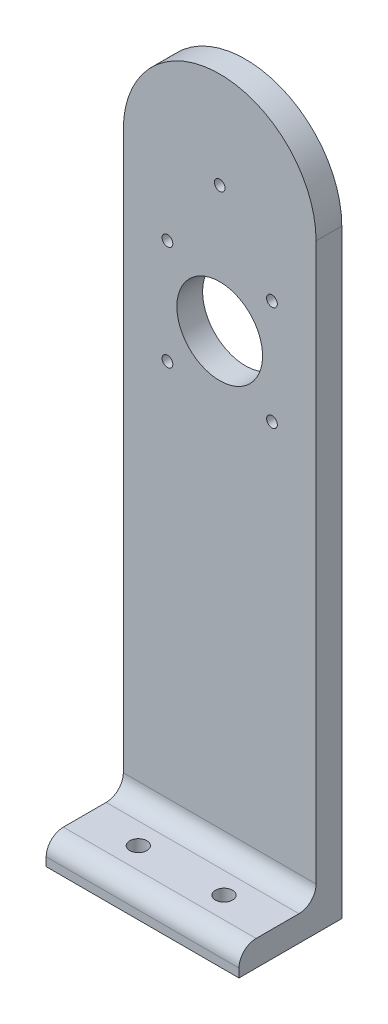
ISO-10303-21;
HEADER;
FILE_DESCRIPTION(('STEP AP214'),'2;1');
FILE_NAME('part.step','',(''),(''),'','','');
FILE_SCHEMA(('AUTOMOTIVE_DESIGN { 1 0 10303 214 1 1 1 1 }'));
ENDSEC;
DATA;
#1=APPLICATION_CONTEXT('core data for automotive mechanical design processes');
#2=APPLICATION_PROTOCOL_DEFINITION('international standard','automotive_design',2000,#1);
#3=PRODUCT_CONTEXT('',#1,'mechanical');
#4=PRODUCT('Part','Part','',(#3));
#5=PRODUCT_RELATED_PRODUCT_CATEGORY('part','',(#4));
#6=PRODUCT_DEFINITION_FORMATION('','',#4);
#7=PRODUCT_DEFINITION_CONTEXT('part definition',#1,'design');
#8=PRODUCT_DEFINITION('design','',#6,#7);
#9=PRODUCT_DEFINITION_SHAPE('','',#8);
#10=(LENGTH_UNIT() NAMED_UNIT(*) SI_UNIT(.MILLI.,.METRE.));
#11=(NAMED_UNIT(*) PLANE_ANGLE_UNIT() SI_UNIT($,.RADIAN.));
#12=(NAMED_UNIT(*) SI_UNIT($,.STERADIAN.) SOLID_ANGLE_UNIT());
#13=UNCERTAINTY_MEASURE_WITH_UNIT(LENGTH_MEASURE(1.E-05),#10,'distance_accuracy_value','');
#14=(GEOMETRIC_REPRESENTATION_CONTEXT(3) GLOBAL_UNCERTAINTY_ASSIGNED_CONTEXT((#13)) GLOBAL_UNIT_ASSIGNED_CONTEXT((#10,
#11,#12)) REPRESENTATION_CONTEXT('',''));
#15=CARTESIAN_POINT('',(0.,0.,0.));
#16=DIRECTION('',(0.,0.,1.));
#17=DIRECTION('',(1.,0.,0.));
#18=AXIS2_PLACEMENT_3D('',#15,#16,#17);
#19=CARTESIAN_POINT('',(0.,0.,7.62));
#20=DIRECTION('',(0.,0.,-1.));
#21=DIRECTION('',(-1.,0.,0.));
#22=AXIS2_PLACEMENT_3D('',#19,#20,#21);
#23=CYLINDRICAL_SURFACE('',#22,28.575);
#24=CARTESIAN_POINT('',(0.,0.,0.));
#25=DIRECTION('',(0.,0.,1.));
#26=DIRECTION('',(-1.,0.,0.));
#27=AXIS2_PLACEMENT_3D('',#24,#25,#26);
#28=CIRCLE('',#27,28.575);
#29=CARTESIAN_POINT('',(28.575,0.,0.));
#30=VERTEX_POINT('',#29);
#31=CARTESIAN_POINT('',(-28.575,0.,0.));
#32=VERTEX_POINT('',#31);
#33=EDGE_CURVE('E145',#30,#32,#28,.T.);
#34=ORIENTED_EDGE('',*,*,#33,.T.);
#35=DIRECTION('',(0.,0.,-1.));
#36=VECTOR('',#35,1.);
#37=CARTESIAN_POINT('',(-28.575,0.,7.62));
#38=LINE('',#37,#36);
#39=CARTESIAN_POINT('',(-28.575,0.,7.62));
#40=VERTEX_POINT('',#39);
#41=EDGE_CURVE('E165',#40,#32,#38,.T.);
#42=ORIENTED_EDGE('',*,*,#41,.F.);
#43=CARTESIAN_POINT('',(0.,0.,7.62));
#44=DIRECTION('',(0.,0.,1.));
#45=DIRECTION('',(-1.,0.,0.));
#46=AXIS2_PLACEMENT_3D('',#43,#44,#45);
#47=CIRCLE('',#46,28.575);
#48=CARTESIAN_POINT('',(28.575,0.,7.62));
#49=VERTEX_POINT('',#48);
#50=EDGE_CURVE('E147',#49,#40,#47,.T.);
#51=ORIENTED_EDGE('',*,*,#50,.F.);
#52=DIRECTION('',(0.,0.,-1.));
#53=VECTOR('',#52,1.);
#54=CARTESIAN_POINT('',(28.575,0.,7.62));
#55=LINE('',#54,#53);
#56=EDGE_CURVE('E114',#49,#30,#55,.T.);
#57=ORIENTED_EDGE('',*,*,#56,.T.);
#58=EDGE_LOOP('',(#34,#42,#51,#57));
#59=FACE_BOUND('',#58,.T.);
#60=ADVANCED_FACE('F38',(#59),#23,.T.);
#61=CARTESIAN_POINT('',(-28.575,0.,7.62));
#62=DIRECTION('',(1.,0.,0.));
#63=DIRECTION('',(0.,1.,0.));
#64=AXIS2_PLACEMENT_3D('',#61,#62,#63);
#65=PLANE('',#64);
#66=DIRECTION('',(0.,-1.,0.));
#67=VECTOR('',#66,1.);
#68=CARTESIAN_POINT('',(-28.575,0.,0.));
#69=LINE('',#68,#67);
#70=CARTESIAN_POINT('',(-28.575,-177.8,0.));
#71=VERTEX_POINT('',#70);
#72=EDGE_CURVE('E158',#32,#71,#69,.T.);
#73=ORIENTED_EDGE('',*,*,#72,.T.);
#74=DIRECTION('',(0.,0.,-1.));
#75=VECTOR('',#74,1.);
#76=CARTESIAN_POINT('',(-28.575,-177.8,7.62));
#77=LINE('',#76,#75);
#78=CARTESIAN_POINT('',(-28.575,-177.8,30.48));
#79=VERTEX_POINT('',#78);
#80=EDGE_CURVE('E113',#79,#71,#77,.T.);
#81=ORIENTED_EDGE('',*,*,#80,.F.);
#82=DIRECTION('',(0.,1.,0.));
#83=VECTOR('',#82,1.);
#84=CARTESIAN_POINT('',(-28.575,-177.8,30.48));
#85=LINE('',#84,#83);
#86=CARTESIAN_POINT('',(-28.575,-175.26,30.48));
#87=VERTEX_POINT('',#86);
#88=EDGE_CURVE('E121',#79,#87,#85,.T.);
#89=ORIENTED_EDGE('',*,*,#88,.T.);
#90=CARTESIAN_POINT('',(-28.575,-175.26,25.4));
#91=DIRECTION('',(-1.,0.,0.));
#92=DIRECTION('',(0.,1.,0.));
#93=AXIS2_PLACEMENT_3D('',#90,#91,#92);
#94=CIRCLE('',#93,5.08);
#95=CARTESIAN_POINT('',(-28.575,-170.18,25.4));
#96=VERTEX_POINT('',#95);
#97=EDGE_CURVE('E132',#87,#96,#94,.T.);
#98=ORIENTED_EDGE('',*,*,#97,.T.);
#99=DIRECTION('',(0.,0.,-1.));
#100=VECTOR('',#99,1.);
#101=CARTESIAN_POINT('',(-28.575,-170.18,0.));
#102=LINE('',#101,#100);
#103=CARTESIAN_POINT('',(-28.575,-170.18,12.7));
#104=VERTEX_POINT('',#103);
#105=EDGE_CURVE('E129',#96,#104,#102,.T.);
#106=ORIENTED_EDGE('',*,*,#105,.T.);
#107=CARTESIAN_POINT('',(-28.575,-165.1,12.7));
#108=DIRECTION('',(1.,0.,0.));
#109=DIRECTION('',(0.,1.,0.));
#110=AXIS2_PLACEMENT_3D('',#107,#108,#109);
#111=CIRCLE('',#110,5.08);
#112=CARTESIAN_POINT('',(-28.575,-165.1,7.62));
#113=VERTEX_POINT('',#112);
#114=EDGE_CURVE('E11',#104,#113,#111,.T.);
#115=ORIENTED_EDGE('',*,*,#114,.T.);
#116=DIRECTION('',(0.,-1.,0.));
#117=VECTOR('',#116,1.);
#118=CARTESIAN_POINT('',(-28.575,0.,7.62));
#119=LINE('',#118,#117);
#120=EDGE_CURVE('E150',#40,#113,#119,.T.);
#121=ORIENTED_EDGE('',*,*,#120,.F.);
#122=ORIENTED_EDGE('',*,*,#41,.T.);
#123=EDGE_LOOP('',(#73,#81,#89,#98,#106,#115,#121,#122));
#124=FACE_BOUND('',#123,.T.);
#125=ADVANCED_FACE('F182',(#124),#65,.F.);
#126=CARTESIAN_POINT('',(-28.575,-177.8,7.62));
#127=DIRECTION('',(0.,1.,0.));
#128=DIRECTION('',(0.,0.,1.));
#129=AXIS2_PLACEMENT_3D('',#126,#127,#128);
#130=PLANE('',#129);
#131=CARTESIAN_POINT('',(12.7,-177.8,19.05));
#132=DIRECTION('',(0.,1.,0.));
#133=DIRECTION('',(-1.,0.,0.));
#134=AXIS2_PLACEMENT_3D('',#131,#132,#133);
#135=CIRCLE('',#134,2.54);
#136=CARTESIAN_POINT('',(10.16,-177.8,19.05));
#137=VERTEX_POINT('',#136);
#138=EDGE_CURVE('E140',#137,#137,#135,.T.);
#139=ORIENTED_EDGE('',*,*,#138,.T.);
#140=EDGE_LOOP('',(#139));
#141=FACE_BOUND('',#140,.T.);
#142=CARTESIAN_POINT('',(-12.7,-177.8,19.05));
#143=DIRECTION('',(0.,1.,0.));
#144=DIRECTION('',(-1.,0.,0.));
#145=AXIS2_PLACEMENT_3D('',#142,#143,#144);
#146=CIRCLE('',#145,2.54);
#147=CARTESIAN_POINT('',(-15.24,-177.8,19.05));
#148=VERTEX_POINT('',#147);
#149=EDGE_CURVE('E284',#148,#148,#146,.T.);
#150=ORIENTED_EDGE('',*,*,#149,.T.);
#151=EDGE_LOOP('',(#150));
#152=FACE_BOUND('',#151,.T.);
#153=DIRECTION('',(1.,0.,0.));
#154=VECTOR('',#153,1.);
#155=CARTESIAN_POINT('',(-28.575,-177.8,0.));
#156=LINE('',#155,#154);
#157=CARTESIAN_POINT('',(28.575,-177.8,0.));
#158=VERTEX_POINT('',#157);
#159=EDGE_CURVE('E110',#71,#158,#156,.T.);
#160=ORIENTED_EDGE('',*,*,#159,.T.);
#161=DIRECTION('',(0.,0.,-1.));
#162=VECTOR('',#161,1.);
#163=CARTESIAN_POINT('',(28.575,-177.8,7.62));
#164=LINE('',#163,#162);
#165=CARTESIAN_POINT('',(28.575,-177.8,30.48));
#166=VERTEX_POINT('',#165);
#167=EDGE_CURVE('E103',#166,#158,#164,.T.);
#168=ORIENTED_EDGE('',*,*,#167,.F.);
#169=DIRECTION('',(-1.,0.,0.));
#170=VECTOR('',#169,1.);
#171=CARTESIAN_POINT('',(28.575,-177.8,30.48));
#172=LINE('',#171,#170);
#173=EDGE_CURVE('E107',#166,#79,#172,.T.);
#174=ORIENTED_EDGE('',*,*,#173,.T.);
#175=ORIENTED_EDGE('',*,*,#80,.T.);
#176=EDGE_LOOP('',(#160,#168,#174,#175));
#177=FACE_BOUND('',#176,.T.);
#178=ADVANCED_FACE('F105',(#141,#152,#177),#130,.F.);
#179=CARTESIAN_POINT('',(28.575,-177.8,7.62));
#180=DIRECTION('',(-1.,0.,0.));
#181=DIRECTION('',(0.,-1.,0.));
#182=AXIS2_PLACEMENT_3D('',#179,#180,#181);
#183=PLANE('',#182);
#184=DIRECTION('',(0.,1.,0.));
#185=VECTOR('',#184,1.);
#186=CARTESIAN_POINT('',(28.575,-177.8,7.62));
#187=LINE('',#186,#185);
#188=CARTESIAN_POINT('',(28.575,-165.1,7.62));
#189=VERTEX_POINT('',#188);
#190=EDGE_CURVE('E154',#189,#49,#187,.T.);
#191=ORIENTED_EDGE('',*,*,#190,.F.);
#192=CARTESIAN_POINT('',(28.575,-165.1,12.7));
#193=DIRECTION('',(-1.,0.,0.));
#194=DIRECTION('',(0.,-1.,0.));
#195=AXIS2_PLACEMENT_3D('',#192,#193,#194);
#196=CIRCLE('',#195,5.08);
#197=CARTESIAN_POINT('',(28.575,-170.18,12.7));
#198=VERTEX_POINT('',#197);
#199=EDGE_CURVE('E46',#189,#198,#196,.T.);
#200=ORIENTED_EDGE('',*,*,#199,.T.);
#201=DIRECTION('',(0.,0.,-1.));
#202=VECTOR('',#201,1.);
#203=CARTESIAN_POINT('',(28.575,-170.18,0.));
#204=LINE('',#203,#202);
#205=CARTESIAN_POINT('',(28.575,-170.18,25.4));
#206=VERTEX_POINT('',#205);
#207=EDGE_CURVE('E123',#206,#198,#204,.T.);
#208=ORIENTED_EDGE('',*,*,#207,.F.);
#209=CARTESIAN_POINT('',(28.575,-175.26,25.4));
#210=DIRECTION('',(-1.,0.,0.));
#211=DIRECTION('',(0.,1.,0.));
#212=AXIS2_PLACEMENT_3D('',#209,#210,#211);
#213=CIRCLE('',#212,5.08);
#214=CARTESIAN_POINT('',(28.575,-175.26,30.48));
#215=VERTEX_POINT('',#214);
#216=EDGE_CURVE('E128',#215,#206,#213,.T.);
#217=ORIENTED_EDGE('',*,*,#216,.F.);
#218=DIRECTION('',(0.,1.,0.));
#219=VECTOR('',#218,1.);
#220=CARTESIAN_POINT('',(28.575,-177.8,30.48));
#221=LINE('',#220,#219);
#222=EDGE_CURVE('E119',#166,#215,#221,.T.);
#223=ORIENTED_EDGE('',*,*,#222,.F.);
#224=ORIENTED_EDGE('',*,*,#167,.T.);
#225=DIRECTION('',(0.,1.,0.));
#226=VECTOR('',#225,1.);
#227=CARTESIAN_POINT('',(28.575,-177.8,0.));
#228=LINE('',#227,#226);
#229=EDGE_CURVE('E151',#158,#30,#228,.T.);
#230=ORIENTED_EDGE('',*,*,#229,.T.);
#231=ORIENTED_EDGE('',*,*,#56,.F.);
#232=EDGE_LOOP('',(#191,#200,#208,#217,#223,#224,#230,#231));
#233=FACE_BOUND('',#232,.T.);
#234=ADVANCED_FACE('F126',(#233),#183,.F.);
#235=CARTESIAN_POINT('',(0.,0.,7.62));
#236=DIRECTION('',(0.,0.,-1.));
#237=DIRECTION('',(-1.,0.,0.));
#238=AXIS2_PLACEMENT_3D('',#235,#236,#237);
#239=PLANE('',#238);
#240=CARTESIAN_POINT('',(15.494,-52.959,7.62));
#241=DIRECTION('',(0.,0.,-1.));
#242=DIRECTION('',(-1.,0.,0.));
#243=AXIS2_PLACEMENT_3D('',#240,#241,#242);
#244=CIRCLE('',#243,1.5875);
#245=CARTESIAN_POINT('',(13.9065,-52.959,7.62));
#246=VERTEX_POINT('',#245);
#247=EDGE_CURVE('E259',#246,#246,#244,.T.);
#248=ORIENTED_EDGE('',*,*,#247,.T.);
#249=EDGE_LOOP('',(#248));
#250=FACE_BOUND('',#249,.T.);
#251=CARTESIAN_POINT('',(-15.494,-52.959,7.62));
#252=DIRECTION('',(0.,0.,-1.));
#253=DIRECTION('',(-1.,0.,0.));
#254=AXIS2_PLACEMENT_3D('',#251,#252,#253);
#255=CIRCLE('',#254,1.5875);
#256=CARTESIAN_POINT('',(-17.0815,-52.959,7.62));
#257=VERTEX_POINT('',#256);
#258=EDGE_CURVE('E255',#257,#257,#255,.T.);
#259=ORIENTED_EDGE('',*,*,#258,.T.);
#260=EDGE_LOOP('',(#259));
#261=FACE_BOUND('',#260,.T.);
#262=CARTESIAN_POINT('',(-15.494,-21.971,7.62));
#263=DIRECTION('',(0.,0.,-1.));
#264=DIRECTION('',(-1.,0.,0.));
#265=AXIS2_PLACEMENT_3D('',#262,#263,#264);
#266=CIRCLE('',#265,1.5875);
#267=CARTESIAN_POINT('',(-17.0815,-21.971,7.62));
#268=VERTEX_POINT('',#267);
#269=EDGE_CURVE('E253',#268,#268,#266,.T.);
#270=ORIENTED_EDGE('',*,*,#269,.T.);
#271=EDGE_LOOP('',(#270));
#272=FACE_BOUND('',#271,.T.);
#273=CARTESIAN_POINT('',(15.494,-21.971,7.62));
#274=DIRECTION('',(0.,0.,-1.));
#275=DIRECTION('',(-1.,0.,0.));
#276=AXIS2_PLACEMENT_3D('',#273,#274,#275);
#277=CIRCLE('',#276,1.5875);
#278=CARTESIAN_POINT('',(13.9065,-21.971,7.62));
#279=VERTEX_POINT('',#278);
#280=EDGE_CURVE('E256',#279,#279,#277,.T.);
#281=ORIENTED_EDGE('',*,*,#280,.T.);
#282=EDGE_LOOP('',(#281));
#283=FACE_BOUND('',#282,.T.);
#284=CARTESIAN_POINT('',(0.,-37.465,7.62));
#285=DIRECTION('',(0.,0.,-1.));
#286=DIRECTION('',(-1.,0.,0.));
#287=AXIS2_PLACEMENT_3D('',#284,#285,#286);
#288=CIRCLE('',#287,12.7);
#289=CARTESIAN_POINT('',(-12.7,-37.465,7.62));
#290=VERTEX_POINT('',#289);
#291=EDGE_CURVE('E271',#290,#290,#288,.T.);
#292=ORIENTED_EDGE('',*,*,#291,.T.);
#293=EDGE_LOOP('',(#292));
#294=FACE_BOUND('',#293,.T.);
#295=CARTESIAN_POINT('',(0.,0.,7.62));
#296=DIRECTION('',(0.,0.,-1.));
#297=DIRECTION('',(-1.,0.,0.));
#298=AXIS2_PLACEMENT_3D('',#295,#296,#297);
#299=CIRCLE('',#298,1.5875);
#300=CARTESIAN_POINT('',(-1.5875,0.,7.62));
#301=VERTEX_POINT('',#300);
#302=EDGE_CURVE('E277',#301,#301,#299,.T.);
#303=ORIENTED_EDGE('',*,*,#302,.T.);
#304=EDGE_LOOP('',(#303));
#305=FACE_BOUND('',#304,.T.);
#306=ORIENTED_EDGE('',*,*,#120,.T.);
#307=DIRECTION('',(1.,0.,0.));
#308=VECTOR('',#307,1.);
#309=CARTESIAN_POINT('',(0.,-165.1,7.62));
#310=LINE('',#309,#308);
#311=EDGE_CURVE('E168',#113,#189,#310,.T.);
#312=ORIENTED_EDGE('',*,*,#311,.T.);
#313=ORIENTED_EDGE('',*,*,#190,.T.);
#314=ORIENTED_EDGE('',*,*,#50,.T.);
#315=EDGE_LOOP('',(#306,#312,#313,#314));
#316=FACE_BOUND('',#315,.T.);
#317=ADVANCED_FACE('F173',(#250,#261,#272,#283,#294,#305,#316),#239,.F.);
#318=CARTESIAN_POINT('',(0.,0.,0.));
#319=DIRECTION('',(0.,0.,-1.));
#320=DIRECTION('',(-1.,0.,0.));
#321=AXIS2_PLACEMENT_3D('',#318,#319,#320);
#322=PLANE('',#321);
#323=CARTESIAN_POINT('',(15.494,-52.959,0.));
#324=DIRECTION('',(0.,0.,-1.));
#325=DIRECTION('',(-1.,0.,0.));
#326=AXIS2_PLACEMENT_3D('',#323,#324,#325);
#327=CIRCLE('',#326,1.5875);
#328=CARTESIAN_POINT('',(13.9065,-52.959,0.));
#329=VERTEX_POINT('',#328);
#330=EDGE_CURVE('E317',#329,#329,#327,.T.);
#331=ORIENTED_EDGE('',*,*,#330,.F.);
#332=EDGE_LOOP('',(#331));
#333=FACE_BOUND('',#332,.T.);
#334=CARTESIAN_POINT('',(-15.494,-52.959,0.));
#335=DIRECTION('',(0.,0.,-1.));
#336=DIRECTION('',(-1.,0.,0.));
#337=AXIS2_PLACEMENT_3D('',#334,#335,#336);
#338=CIRCLE('',#337,1.5875);
#339=CARTESIAN_POINT('',(-17.0815,-52.959,0.));
#340=VERTEX_POINT('',#339);
#341=EDGE_CURVE('E320',#340,#340,#338,.T.);
#342=ORIENTED_EDGE('',*,*,#341,.F.);
#343=EDGE_LOOP('',(#342));
#344=FACE_BOUND('',#343,.T.);
#345=CARTESIAN_POINT('',(-15.494,-21.971,0.));
#346=DIRECTION('',(0.,0.,-1.));
#347=DIRECTION('',(-1.,0.,0.));
#348=AXIS2_PLACEMENT_3D('',#345,#346,#347);
#349=CIRCLE('',#348,1.5875);
#350=CARTESIAN_POINT('',(-17.0815,-21.971,0.));
#351=VERTEX_POINT('',#350);
#352=EDGE_CURVE('E250',#351,#351,#349,.T.);
#353=ORIENTED_EDGE('',*,*,#352,.F.);
#354=EDGE_LOOP('',(#353));
#355=FACE_BOUND('',#354,.T.);
#356=CARTESIAN_POINT('',(15.494,-21.971,0.));
#357=DIRECTION('',(0.,0.,-1.));
#358=DIRECTION('',(-1.,0.,0.));
#359=AXIS2_PLACEMENT_3D('',#356,#357,#358);
#360=CIRCLE('',#359,1.5875);
#361=CARTESIAN_POINT('',(13.9065,-21.971,0.));
#362=VERTEX_POINT('',#361);
#363=EDGE_CURVE('E262',#362,#362,#360,.T.);
#364=ORIENTED_EDGE('',*,*,#363,.F.);
#365=EDGE_LOOP('',(#364));
#366=FACE_BOUND('',#365,.T.);
#367=CARTESIAN_POINT('',(0.,-37.465,0.));
#368=DIRECTION('',(0.,0.,-1.));
#369=DIRECTION('',(-1.,0.,0.));
#370=AXIS2_PLACEMENT_3D('',#367,#368,#369);
#371=CIRCLE('',#370,12.7);
#372=CARTESIAN_POINT('',(-12.7,-37.465,0.));
#373=VERTEX_POINT('',#372);
#374=EDGE_CURVE('E268',#373,#373,#371,.T.);
#375=ORIENTED_EDGE('',*,*,#374,.F.);
#376=EDGE_LOOP('',(#375));
#377=FACE_BOUND('',#376,.T.);
#378=CARTESIAN_POINT('',(0.,0.,0.));
#379=DIRECTION('',(0.,0.,-1.));
#380=DIRECTION('',(-1.,0.,0.));
#381=AXIS2_PLACEMENT_3D('',#378,#379,#380);
#382=CIRCLE('',#381,1.5875);
#383=CARTESIAN_POINT('',(-1.5875,0.,0.));
#384=VERTEX_POINT('',#383);
#385=EDGE_CURVE('E274',#384,#384,#382,.T.);
#386=ORIENTED_EDGE('',*,*,#385,.F.);
#387=EDGE_LOOP('',(#386));
#388=FACE_BOUND('',#387,.T.);
#389=ORIENTED_EDGE('',*,*,#33,.F.);
#390=ORIENTED_EDGE('',*,*,#229,.F.);
#391=ORIENTED_EDGE('',*,*,#159,.F.);
#392=ORIENTED_EDGE('',*,*,#72,.F.);
#393=EDGE_LOOP('',(#389,#390,#391,#392));
#394=FACE_BOUND('',#393,.T.);
#395=ADVANCED_FACE('F205',(#333,#344,#355,#366,#377,#388,#394),#322,.T.);
#396=CARTESIAN_POINT('',(28.575,-170.18,0.));
#397=DIRECTION('',(0.,1.,0.));
#398=DIRECTION('',(-1.,0.,0.));
#399=AXIS2_PLACEMENT_3D('',#396,#397,#398);
#400=PLANE('',#399);
#401=CARTESIAN_POINT('',(12.7,-170.18,19.05));
#402=DIRECTION('',(0.,1.,0.));
#403=DIRECTION('',(-1.,0.,0.));
#404=AXIS2_PLACEMENT_3D('',#401,#402,#403);
#405=CIRCLE('',#404,2.54);
#406=CARTESIAN_POINT('',(10.16,-170.18,19.05));
#407=VERTEX_POINT('',#406);
#408=EDGE_CURVE('E282',#407,#407,#405,.T.);
#409=ORIENTED_EDGE('',*,*,#408,.F.);
#410=EDGE_LOOP('',(#409));
#411=FACE_BOUND('',#410,.T.);
#412=CARTESIAN_POINT('',(-12.7,-170.18,19.05));
#413=DIRECTION('',(0.,1.,0.));
#414=DIRECTION('',(-1.,0.,0.));
#415=AXIS2_PLACEMENT_3D('',#412,#413,#414);
#416=CIRCLE('',#415,2.54);
#417=CARTESIAN_POINT('',(-15.24,-170.18,19.05));
#418=VERTEX_POINT('',#417);
#419=EDGE_CURVE('E135',#418,#418,#416,.T.);
#420=ORIENTED_EDGE('',*,*,#419,.F.);
#421=EDGE_LOOP('',(#420));
#422=FACE_BOUND('',#421,.T.);
#423=ORIENTED_EDGE('',*,*,#207,.T.);
#424=DIRECTION('',(1.,0.,0.));
#425=VECTOR('',#424,1.);
#426=CARTESIAN_POINT('',(28.575,-170.18,12.7));
#427=LINE('',#426,#425);
#428=EDGE_CURVE('E59',#198,#104,#427,.F.);
#429=ORIENTED_EDGE('',*,*,#428,.T.);
#430=ORIENTED_EDGE('',*,*,#105,.F.);
#431=DIRECTION('',(-1.,0.,0.));
#432=VECTOR('',#431,1.);
#433=CARTESIAN_POINT('',(28.575,-170.18,25.4));
#434=LINE('',#433,#432);
#435=EDGE_CURVE('E143',#206,#96,#434,.T.);
#436=ORIENTED_EDGE('',*,*,#435,.F.);
#437=EDGE_LOOP('',(#423,#429,#430,#436));
#438=FACE_BOUND('',#437,.T.);
#439=ADVANCED_FACE('F208',(#411,#422,#438),#400,.T.);
#440=CARTESIAN_POINT('',(28.575,-175.26,25.4));
#441=DIRECTION('',(-1.,0.,0.));
#442=DIRECTION('',(0.,-1.,0.));
#443=AXIS2_PLACEMENT_3D('',#440,#441,#442);
#444=CYLINDRICAL_SURFACE('',#443,5.08);
#445=ORIENTED_EDGE('',*,*,#97,.F.);
#446=DIRECTION('',(-1.,0.,0.));
#447=VECTOR('',#446,1.);
#448=CARTESIAN_POINT('',(28.575,-175.26,30.48));
#449=LINE('',#448,#447);
#450=EDGE_CURVE('E122',#215,#87,#449,.T.);
#451=ORIENTED_EDGE('',*,*,#450,.F.);
#452=ORIENTED_EDGE('',*,*,#216,.T.);
#453=ORIENTED_EDGE('',*,*,#435,.T.);
#454=EDGE_LOOP('',(#445,#451,#452,#453));
#455=FACE_BOUND('',#454,.T.);
#456=ADVANCED_FACE('F192',(#455),#444,.T.);
#457=CARTESIAN_POINT('',(28.575,-177.8,30.48));
#458=DIRECTION('',(0.,0.,1.));
#459=DIRECTION('',(1.,0.,0.));
#460=AXIS2_PLACEMENT_3D('',#457,#458,#459);
#461=PLANE('',#460);
#462=ORIENTED_EDGE('',*,*,#88,.F.);
#463=ORIENTED_EDGE('',*,*,#173,.F.);
#464=ORIENTED_EDGE('',*,*,#222,.T.);
#465=ORIENTED_EDGE('',*,*,#450,.T.);
#466=EDGE_LOOP('',(#462,#463,#464,#465));
#467=FACE_BOUND('',#466,.T.);
#468=ADVANCED_FACE('F118',(#467),#461,.T.);
#469=CARTESIAN_POINT('',(0.,-165.1,12.7));
#470=DIRECTION('',(1.,0.,0.));
#471=DIRECTION('',(0.,1.,0.));
#472=AXIS2_PLACEMENT_3D('',#469,#470,#471);
#473=CYLINDRICAL_SURFACE('',#472,5.08);
#474=ORIENTED_EDGE('',*,*,#114,.F.);
#475=ORIENTED_EDGE('',*,*,#428,.F.);
#476=ORIENTED_EDGE('',*,*,#199,.F.);
#477=ORIENTED_EDGE('',*,*,#311,.F.);
#478=EDGE_LOOP('',(#474,#475,#476,#477));
#479=FACE_BOUND('',#478,.T.);
#480=ADVANCED_FACE('F40',(#479),#473,.F.);
#481=CARTESIAN_POINT('',(-12.7,-177.8,19.05));
#482=DIRECTION('',(0.,1.,0.));
#483=DIRECTION('',(-1.,0.,0.));
#484=AXIS2_PLACEMENT_3D('',#481,#482,#483);
#485=CYLINDRICAL_SURFACE('',#484,2.54);
#486=ORIENTED_EDGE('',*,*,#149,.F.);
#487=EDGE_LOOP('',(#486));
#488=FACE_BOUND('',#487,.T.);
#489=ORIENTED_EDGE('',*,*,#419,.T.);
#490=EDGE_LOOP('',(#489));
#491=FACE_BOUND('',#490,.T.);
#492=ADVANCED_FACE('F184',(#488,#491),#485,.F.);
#493=CARTESIAN_POINT('',(12.7,-177.8,19.05));
#494=DIRECTION('',(0.,1.,0.));
#495=DIRECTION('',(-1.,0.,0.));
#496=AXIS2_PLACEMENT_3D('',#493,#494,#495);
#497=CYLINDRICAL_SURFACE('',#496,2.54);
#498=ORIENTED_EDGE('',*,*,#138,.F.);
#499=EDGE_LOOP('',(#498));
#500=FACE_BOUND('',#499,.T.);
#501=ORIENTED_EDGE('',*,*,#408,.T.);
#502=EDGE_LOOP('',(#501));
#503=FACE_BOUND('',#502,.T.);
#504=ADVANCED_FACE('F189',(#500,#503),#497,.F.);
#505=CARTESIAN_POINT('',(0.,0.,30.48));
#506=DIRECTION('',(0.,0.,-1.));
#507=DIRECTION('',(-1.,0.,0.));
#508=AXIS2_PLACEMENT_3D('',#505,#506,#507);
#509=CYLINDRICAL_SURFACE('',#508,1.5875);
#510=ORIENTED_EDGE('',*,*,#385,.T.);
#511=EDGE_LOOP('',(#510));
#512=FACE_BOUND('',#511,.T.);
#513=ORIENTED_EDGE('',*,*,#302,.F.);
#514=EDGE_LOOP('',(#513));
#515=FACE_BOUND('',#514,.T.);
#516=ADVANCED_FACE('F221',(#512,#515),#509,.F.);
#517=CARTESIAN_POINT('',(0.,-37.465,30.48));
#518=DIRECTION('',(0.,0.,-1.));
#519=DIRECTION('',(-1.,0.,0.));
#520=AXIS2_PLACEMENT_3D('',#517,#518,#519);
#521=CYLINDRICAL_SURFACE('',#520,12.7);
#522=ORIENTED_EDGE('',*,*,#374,.T.);
#523=EDGE_LOOP('',(#522));
#524=FACE_BOUND('',#523,.T.);
#525=ORIENTED_EDGE('',*,*,#291,.F.);
#526=EDGE_LOOP('',(#525));
#527=FACE_BOUND('',#526,.T.);
#528=ADVANCED_FACE('F225',(#524,#527),#521,.F.);
#529=CARTESIAN_POINT('',(15.494,-21.971,30.48));
#530=DIRECTION('',(0.,0.,-1.));
#531=DIRECTION('',(-1.,0.,0.));
#532=AXIS2_PLACEMENT_3D('',#529,#530,#531);
#533=CYLINDRICAL_SURFACE('',#532,1.5875);
#534=ORIENTED_EDGE('',*,*,#363,.T.);
#535=EDGE_LOOP('',(#534));
#536=FACE_BOUND('',#535,.T.);
#537=ORIENTED_EDGE('',*,*,#280,.F.);
#538=EDGE_LOOP('',(#537));
#539=FACE_BOUND('',#538,.T.);
#540=ADVANCED_FACE('F229',(#536,#539),#533,.F.);
#541=CARTESIAN_POINT('',(-15.494,-21.971,30.48));
#542=DIRECTION('',(0.,0.,-1.));
#543=DIRECTION('',(-1.,0.,0.));
#544=AXIS2_PLACEMENT_3D('',#541,#542,#543);
#545=CYLINDRICAL_SURFACE('',#544,1.5875);
#546=ORIENTED_EDGE('',*,*,#352,.T.);
#547=EDGE_LOOP('',(#546));
#548=FACE_BOUND('',#547,.T.);
#549=ORIENTED_EDGE('',*,*,#269,.F.);
#550=EDGE_LOOP('',(#549));
#551=FACE_BOUND('',#550,.T.);
#552=ADVANCED_FACE('F233',(#548,#551),#545,.F.);
#553=CARTESIAN_POINT('',(-15.494,-52.959,30.48));
#554=DIRECTION('',(0.,0.,-1.));
#555=DIRECTION('',(-1.,0.,0.));
#556=AXIS2_PLACEMENT_3D('',#553,#554,#555);
#557=CYLINDRICAL_SURFACE('',#556,1.5875);
#558=ORIENTED_EDGE('',*,*,#341,.T.);
#559=EDGE_LOOP('',(#558));
#560=FACE_BOUND('',#559,.T.);
#561=ORIENTED_EDGE('',*,*,#258,.F.);
#562=EDGE_LOOP('',(#561));
#563=FACE_BOUND('',#562,.T.);
#564=ADVANCED_FACE('F238',(#560,#563),#557,.F.);
#565=CARTESIAN_POINT('',(15.494,-52.959,30.48));
#566=DIRECTION('',(0.,0.,-1.));
#567=DIRECTION('',(-1.,0.,0.));
#568=AXIS2_PLACEMENT_3D('',#565,#566,#567);
#569=CYLINDRICAL_SURFACE('',#568,1.5875);
#570=ORIENTED_EDGE('',*,*,#330,.T.);
#571=EDGE_LOOP('',(#570));
#572=FACE_BOUND('',#571,.T.);
#573=ORIENTED_EDGE('',*,*,#247,.F.);
#574=EDGE_LOOP('',(#573));
#575=FACE_BOUND('',#574,.T.);
#576=ADVANCED_FACE('F235',(#572,#575),#569,.F.);
#577=CLOSED_SHELL('',(#60,#125,#178,#234,#317,#395,#439,#456,#468,#480,#492,#504,#516,#528,#540,
#552,#564,#576));
#578=MANIFOLD_SOLID_BREP('B2',#577);
#579=ADVANCED_BREP_SHAPE_REPRESENTATION('',(#18,#578),#14);
#580=SHAPE_DEFINITION_REPRESENTATION(#9,#579);
ENDSEC;
END-ISO-10303-21;
